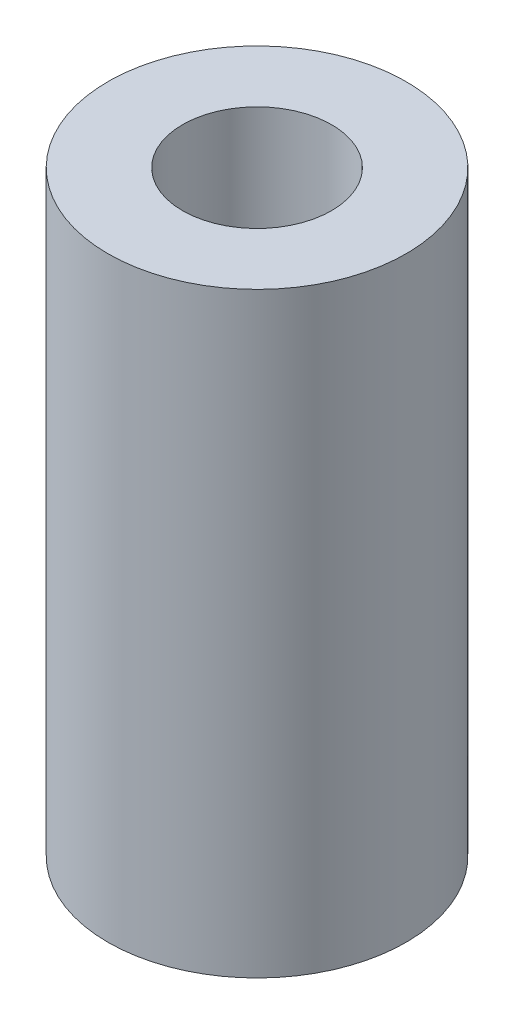
ISO-10303-21;
HEADER;
FILE_DESCRIPTION(('STEP AP214'),'2;1');
FILE_NAME('part.step','',(''),(''),'','','');
FILE_SCHEMA(('AUTOMOTIVE_DESIGN { 1 0 10303 214 1 1 1 1 }'));
ENDSEC;
DATA;
#1=APPLICATION_CONTEXT('core data for automotive mechanical design processes');
#2=APPLICATION_PROTOCOL_DEFINITION('international standard','automotive_design',2000,#1);
#3=PRODUCT_CONTEXT('',#1,'mechanical');
#4=PRODUCT('Part','Part','',(#3));
#5=PRODUCT_RELATED_PRODUCT_CATEGORY('part','',(#4));
#6=PRODUCT_DEFINITION_FORMATION('','',#4);
#7=PRODUCT_DEFINITION_CONTEXT('part definition',#1,'design');
#8=PRODUCT_DEFINITION('design','',#6,#7);
#9=PRODUCT_DEFINITION_SHAPE('','',#8);
#10=(LENGTH_UNIT() NAMED_UNIT(*) SI_UNIT(.MILLI.,.METRE.));
#11=(NAMED_UNIT(*) PLANE_ANGLE_UNIT() SI_UNIT($,.RADIAN.));
#12=(NAMED_UNIT(*) SI_UNIT($,.STERADIAN.) SOLID_ANGLE_UNIT());
#13=UNCERTAINTY_MEASURE_WITH_UNIT(LENGTH_MEASURE(1.E-05),#10,'distance_accuracy_value','');
#14=(GEOMETRIC_REPRESENTATION_CONTEXT(3) GLOBAL_UNCERTAINTY_ASSIGNED_CONTEXT((#13)) GLOBAL_UNIT_ASSIGNED_CONTEXT((#10,
#11,#12)) REPRESENTATION_CONTEXT('',''));
#15=CARTESIAN_POINT('',(0.,0.,0.));
#16=DIRECTION('',(0.,0.,1.));
#17=DIRECTION('',(1.,0.,0.));
#18=AXIS2_PLACEMENT_3D('',#15,#16,#17);
#19=CARTESIAN_POINT('',(0.,10.,0.));
#20=DIRECTION('',(0.,-1.,0.));
#21=DIRECTION('',(0.,0.,-1.));
#22=AXIS2_PLACEMENT_3D('',#19,#20,#21);
#23=CYLINDRICAL_SURFACE('',#22,2.5);
#24=CARTESIAN_POINT('',(0.,10.,0.));
#25=DIRECTION('',(0.,1.,0.));
#26=DIRECTION('',(0.,0.,1.));
#27=AXIS2_PLACEMENT_3D('',#24,#25,#26);
#28=CIRCLE('',#27,2.5);
#29=CARTESIAN_POINT('',(0.,10.,2.5));
#30=VERTEX_POINT('',#29);
#31=EDGE_CURVE('E10',#30,#30,#28,.T.);
#32=ORIENTED_EDGE('',*,*,#31,.F.);
#33=EDGE_LOOP('',(#32));
#34=FACE_BOUND('',#33,.T.);
#35=CARTESIAN_POINT('',(0.,0.,0.));
#36=DIRECTION('',(0.,1.,0.));
#37=DIRECTION('',(0.,0.,1.));
#38=AXIS2_PLACEMENT_3D('',#35,#36,#37);
#39=CIRCLE('',#38,2.5);
#40=CARTESIAN_POINT('',(0.,0.,2.5));
#41=VERTEX_POINT('',#40);
#42=EDGE_CURVE('E39',#41,#41,#39,.T.);
#43=ORIENTED_EDGE('',*,*,#42,.T.);
#44=EDGE_LOOP('',(#43));
#45=FACE_BOUND('',#44,.T.);
#46=ADVANCED_FACE('F36',(#34,#45),#23,.T.);
#47=CARTESIAN_POINT('',(0.,10.,0.));
#48=DIRECTION('',(0.,1.,0.));
#49=DIRECTION('',(0.,0.,1.));
#50=AXIS2_PLACEMENT_3D('',#47,#48,#49);
#51=PLANE('',#50);
#52=CARTESIAN_POINT('',(0.,10.,0.));
#53=DIRECTION('',(0.,1.,0.));
#54=DIRECTION('',(0.,0.,1.));
#55=AXIS2_PLACEMENT_3D('',#52,#53,#54);
#56=CIRCLE('',#55,1.25);
#57=CARTESIAN_POINT('',(0.,10.,1.25));
#58=VERTEX_POINT('',#57);
#59=EDGE_CURVE('E50',#58,#58,#56,.T.);
#60=ORIENTED_EDGE('',*,*,#59,.F.);
#61=EDGE_LOOP('',(#60));
#62=FACE_BOUND('',#61,.T.);
#63=ORIENTED_EDGE('',*,*,#31,.T.);
#64=EDGE_LOOP('',(#63));
#65=FACE_BOUND('',#64,.T.);
#66=ADVANCED_FACE('F56',(#62,#65),#51,.T.);
#67=CARTESIAN_POINT('',(0.,0.,0.));
#68=DIRECTION('',(0.,1.,0.));
#69=DIRECTION('',(0.,0.,1.));
#70=AXIS2_PLACEMENT_3D('',#67,#68,#69);
#71=PLANE('',#70);
#72=CARTESIAN_POINT('',(0.,0.,0.));
#73=DIRECTION('',(0.,1.,0.));
#74=DIRECTION('',(0.,0.,1.));
#75=AXIS2_PLACEMENT_3D('',#72,#73,#74);
#76=CIRCLE('',#75,1.25);
#77=CARTESIAN_POINT('',(0.,0.,1.25));
#78=VERTEX_POINT('',#77);
#79=EDGE_CURVE('E46',#78,#78,#76,.T.);
#80=ORIENTED_EDGE('',*,*,#79,.T.);
#81=EDGE_LOOP('',(#80));
#82=FACE_BOUND('',#81,.T.);
#83=ORIENTED_EDGE('',*,*,#42,.F.);
#84=EDGE_LOOP('',(#83));
#85=FACE_BOUND('',#84,.T.);
#86=ADVANCED_FACE('F58',(#82,#85),#71,.F.);
#87=CARTESIAN_POINT('',(0.,10.,0.));
#88=DIRECTION('',(0.,1.,0.));
#89=DIRECTION('',(0.,0.,1.));
#90=AXIS2_PLACEMENT_3D('',#87,#88,#89);
#91=CYLINDRICAL_SURFACE('',#90,1.25);
#92=ORIENTED_EDGE('',*,*,#79,.F.);
#93=EDGE_LOOP('',(#92));
#94=FACE_BOUND('',#93,.T.);
#95=ORIENTED_EDGE('',*,*,#59,.T.);
#96=EDGE_LOOP('',(#95));
#97=FACE_BOUND('',#96,.T.);
#98=ADVANCED_FACE('F54',(#94,#97),#91,.F.);
#99=CLOSED_SHELL('',(#46,#66,#86,#98));
#100=MANIFOLD_SOLID_BREP('B2',#99);
#101=ADVANCED_BREP_SHAPE_REPRESENTATION('',(#18,#100),#14);
#102=SHAPE_DEFINITION_REPRESENTATION(#9,#101);
ENDSEC;
END-ISO-10303-21;
